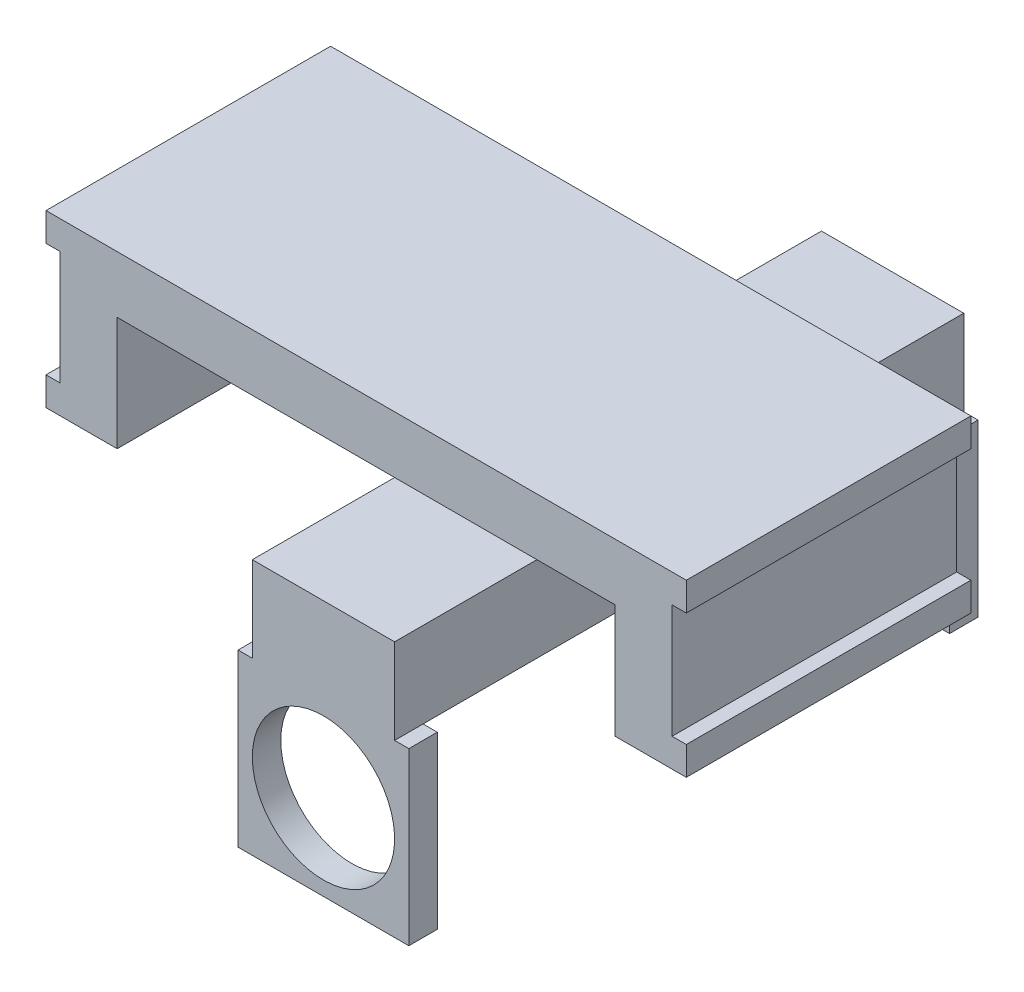
ISO-10303-21;
HEADER;
FILE_DESCRIPTION(('STEP AP214'),'2;1');
FILE_NAME('part.step','',(''),(''),'','','');
FILE_SCHEMA(('AUTOMOTIVE_DESIGN { 1 0 10303 214 1 1 1 1 }'));
ENDSEC;
DATA;
#1=APPLICATION_CONTEXT('core data for automotive mechanical design processes');
#2=APPLICATION_PROTOCOL_DEFINITION('international standard','automotive_design',2000,#1);
#3=PRODUCT_CONTEXT('',#1,'mechanical');
#4=PRODUCT('Part','Part','',(#3));
#5=PRODUCT_RELATED_PRODUCT_CATEGORY('part','',(#4));
#6=PRODUCT_DEFINITION_FORMATION('','',#4);
#7=PRODUCT_DEFINITION_CONTEXT('part definition',#1,'design');
#8=PRODUCT_DEFINITION('design','',#6,#7);
#9=PRODUCT_DEFINITION_SHAPE('','',#8);
#10=(LENGTH_UNIT() NAMED_UNIT(*) SI_UNIT(.MILLI.,.METRE.));
#11=(NAMED_UNIT(*) PLANE_ANGLE_UNIT() SI_UNIT($,.RADIAN.));
#12=(NAMED_UNIT(*) SI_UNIT($,.STERADIAN.) SOLID_ANGLE_UNIT());
#13=UNCERTAINTY_MEASURE_WITH_UNIT(LENGTH_MEASURE(1.E-05),#10,'distance_accuracy_value','');
#14=(GEOMETRIC_REPRESENTATION_CONTEXT(3) GLOBAL_UNCERTAINTY_ASSIGNED_CONTEXT((#13)) GLOBAL_UNIT_ASSIGNED_CONTEXT((#10,
#11,#12)) REPRESENTATION_CONTEXT('',''));
#15=CARTESIAN_POINT('',(0.,0.,0.));
#16=DIRECTION('',(0.,0.,1.));
#17=DIRECTION('',(1.,0.,0.));
#18=AXIS2_PLACEMENT_3D('',#15,#16,#17);
#19=CARTESIAN_POINT('',(0.,2.54,0.));
#20=DIRECTION('',(0.,-1.,0.));
#21=DIRECTION('',(0.,0.,-1.));
#22=AXIS2_PLACEMENT_3D('',#19,#20,#21);
#23=PLANE('',#22);
#24=DIRECTION('',(0.,0.,1.));
#25=VECTOR('',#24,1.);
#26=CARTESIAN_POINT('',(15.24,2.54,0.));
#27=LINE('',#26,#25);
#28=CARTESIAN_POINT('',(15.24,2.54,-22.86));
#29=VERTEX_POINT('',#28);
#30=CARTESIAN_POINT('',(15.24,2.54,22.86));
#31=VERTEX_POINT('',#30);
#32=EDGE_CURVE('E340',#29,#31,#27,.T.);
#33=ORIENTED_EDGE('',*,*,#32,.T.);
#34=DIRECTION('',(1.,0.,0.));
#35=VECTOR('',#34,1.);
#36=CARTESIAN_POINT('',(1.27,2.54,22.86));
#37=LINE('',#36,#35);
#38=CARTESIAN_POINT('',(2.54,2.54,22.86));
#39=VERTEX_POINT('',#38);
#40=EDGE_CURVE('E57',#39,#31,#37,.T.);
#41=ORIENTED_EDGE('',*,*,#40,.F.);
#42=DIRECTION('',(0.,0.,-1.));
#43=VECTOR('',#42,1.);
#44=CARTESIAN_POINT('',(2.54,2.54,0.));
#45=LINE('',#44,#43);
#46=CARTESIAN_POINT('',(2.54,2.54,-22.86));
#47=VERTEX_POINT('',#46);
#48=EDGE_CURVE('E341',#39,#47,#45,.T.);
#49=ORIENTED_EDGE('',*,*,#48,.T.);
#50=DIRECTION('',(1.,0.,0.));
#51=VECTOR('',#50,1.);
#52=CARTESIAN_POINT('',(1.27,2.54,-22.86));
#53=LINE('',#52,#51);
#54=EDGE_CURVE('E11',#47,#29,#53,.T.);
#55=ORIENTED_EDGE('',*,*,#54,.T.);
#56=EDGE_LOOP('',(#33,#41,#49,#55));
#57=FACE_BOUND('',#56,.T.);
#58=ADVANCED_FACE('F39',(#57),#23,.T.);
#59=CARTESIAN_POINT('',(0.,10.16,0.));
#60=DIRECTION('',(0.,-1.,0.));
#61=DIRECTION('',(0.,0.,-1.));
#62=AXIS2_PLACEMENT_3D('',#59,#60,#61);
#63=PLANE('',#62);
#64=DIRECTION('',(1.,0.,0.));
#65=VECTOR('',#64,1.);
#66=CARTESIAN_POINT('',(-22.225,10.16,-12.7));
#67=LINE('',#66,#65);
#68=CARTESIAN_POINT('',(-22.225,10.16,-12.7));
#69=VERTEX_POINT('',#68);
#70=CARTESIAN_POINT('',(2.54,10.16,-12.7));
#71=VERTEX_POINT('',#70);
#72=EDGE_CURVE('E426',#69,#71,#67,.T.);
#73=ORIENTED_EDGE('',*,*,#72,.T.);
#74=DIRECTION('',(0.,0.,1.));
#75=VECTOR('',#74,1.);
#76=CARTESIAN_POINT('',(2.54,10.16,0.));
#77=LINE('',#76,#75);
#78=CARTESIAN_POINT('',(2.54,10.16,12.7));
#79=VERTEX_POINT('',#78);
#80=EDGE_CURVE('E43',#71,#79,#77,.T.);
#81=ORIENTED_EDGE('',*,*,#80,.T.);
#82=DIRECTION('',(-1.,0.,0.));
#83=VECTOR('',#82,1.);
#84=CARTESIAN_POINT('',(-22.225,10.16,12.7));
#85=LINE('',#84,#83);
#86=CARTESIAN_POINT('',(-22.225,10.16,12.7));
#87=VERTEX_POINT('',#86);
#88=EDGE_CURVE('E433',#79,#87,#85,.T.);
#89=ORIENTED_EDGE('',*,*,#88,.T.);
#90=DIRECTION('',(0.,0.,-1.));
#91=VECTOR('',#90,1.);
#92=CARTESIAN_POINT('',(-22.225,10.16,12.7));
#93=LINE('',#92,#91);
#94=EDGE_CURVE('E421',#87,#69,#93,.T.);
#95=ORIENTED_EDGE('',*,*,#94,.T.);
#96=EDGE_LOOP('',(#73,#81,#89,#95));
#97=FACE_BOUND('',#96,.T.);
#98=ADVANCED_FACE('F497',(#97),#63,.T.);
#99=CARTESIAN_POINT('',(22.225,10.16,12.7));
#100=VERTEX_POINT('',#99);
#101=CARTESIAN_POINT('',(15.24,10.16,12.7));
#102=VERTEX_POINT('',#101);
#103=EDGE_CURVE('E434',#100,#102,#85,.T.);
#104=ORIENTED_EDGE('',*,*,#103,.T.);
#105=DIRECTION('',(0.,0.,-1.));
#106=VECTOR('',#105,1.);
#107=CARTESIAN_POINT('',(15.24,10.16,0.));
#108=LINE('',#107,#106);
#109=CARTESIAN_POINT('',(15.24,10.16,-12.7));
#110=VERTEX_POINT('',#109);
#111=EDGE_CURVE('E488',#102,#110,#108,.T.);
#112=ORIENTED_EDGE('',*,*,#111,.T.);
#113=CARTESIAN_POINT('',(22.225,10.16,-12.7));
#114=VERTEX_POINT('',#113);
#115=EDGE_CURVE('E424',#110,#114,#67,.T.);
#116=ORIENTED_EDGE('',*,*,#115,.T.);
#117=DIRECTION('',(0.,0.,1.));
#118=VECTOR('',#117,1.);
#119=CARTESIAN_POINT('',(22.225,10.16,12.7));
#120=LINE('',#119,#118);
#121=EDGE_CURVE('E429',#114,#100,#120,.T.);
#122=ORIENTED_EDGE('',*,*,#121,.T.);
#123=EDGE_LOOP('',(#104,#112,#116,#122));
#124=FACE_BOUND('',#123,.T.);
#125=ADVANCED_FACE('F547',(#124),#63,.T.);
#126=CARTESIAN_POINT('',(28.575,15.24,12.7));
#127=DIRECTION('',(-1.,0.,0.));
#128=DIRECTION('',(0.,0.,1.));
#129=AXIS2_PLACEMENT_3D('',#126,#127,#128);
#130=PLANE('',#129);
#131=DIRECTION('',(0.,-1.,0.));
#132=VECTOR('',#131,1.);
#133=CARTESIAN_POINT('',(28.575,15.24,-12.7));
#134=LINE('',#133,#132);
#135=CARTESIAN_POINT('',(28.575,2.54000000000001,-12.7));
#136=VERTEX_POINT('',#135);
#137=CARTESIAN_POINT('',(28.575,0.,-12.7));
#138=VERTEX_POINT('',#137);
#139=EDGE_CURVE('E485',#136,#138,#134,.T.);
#140=ORIENTED_EDGE('',*,*,#139,.F.);
#141=DIRECTION('',(0.,0.,1.));
#142=VECTOR('',#141,1.);
#143=CARTESIAN_POINT('',(28.575,2.54000000000001,-12.7));
#144=LINE('',#143,#142);
#145=CARTESIAN_POINT('',(28.575,2.54000000000001,12.7));
#146=VERTEX_POINT('',#145);
#147=EDGE_CURVE('E368',#136,#146,#144,.T.);
#148=ORIENTED_EDGE('',*,*,#147,.T.);
#149=DIRECTION('',(0.,-1.,0.));
#150=VECTOR('',#149,1.);
#151=CARTESIAN_POINT('',(28.575,15.24,12.7));
#152=LINE('',#151,#150);
#153=CARTESIAN_POINT('',(28.575,0.,12.7));
#154=VERTEX_POINT('',#153);
#155=EDGE_CURVE('E461',#146,#154,#152,.T.);
#156=ORIENTED_EDGE('',*,*,#155,.T.);
#157=DIRECTION('',(0.,0.,-1.));
#158=VECTOR('',#157,1.);
#159=CARTESIAN_POINT('',(28.575,0.,12.7));
#160=LINE('',#159,#158);
#161=EDGE_CURVE('E443',#154,#138,#160,.T.);
#162=ORIENTED_EDGE('',*,*,#161,.T.);
#163=EDGE_LOOP('',(#140,#148,#156,#162));
#164=FACE_BOUND('',#163,.T.);
#165=ADVANCED_FACE('F623',(#164),#130,.F.);
#166=CARTESIAN_POINT('',(-28.575,15.24,12.7));
#167=DIRECTION('',(1.,0.,0.));
#168=DIRECTION('',(0.,0.,-1.));
#169=AXIS2_PLACEMENT_3D('',#166,#167,#168);
#170=PLANE('',#169);
#171=DIRECTION('',(0.,-1.,0.));
#172=VECTOR('',#171,1.);
#173=CARTESIAN_POINT('',(-28.575,15.24,-12.7));
#174=LINE('',#173,#172);
#175=CARTESIAN_POINT('',(-28.575,15.24,-12.7));
#176=VERTEX_POINT('',#175);
#177=CARTESIAN_POINT('',(-28.575,12.7,-12.7));
#178=VERTEX_POINT('',#177);
#179=EDGE_CURVE('E482',#176,#178,#174,.T.);
#180=ORIENTED_EDGE('',*,*,#179,.T.);
#181=DIRECTION('',(0.,0.,1.));
#182=VECTOR('',#181,1.);
#183=CARTESIAN_POINT('',(-28.575,12.7,-12.7));
#184=LINE('',#183,#182);
#185=CARTESIAN_POINT('',(-28.575,12.7,12.7));
#186=VERTEX_POINT('',#185);
#187=EDGE_CURVE('E388',#178,#186,#184,.T.);
#188=ORIENTED_EDGE('',*,*,#187,.T.);
#189=DIRECTION('',(0.,-1.,0.));
#190=VECTOR('',#189,1.);
#191=CARTESIAN_POINT('',(-28.575,15.24,12.7));
#192=LINE('',#191,#190);
#193=CARTESIAN_POINT('',(-28.575,15.24,12.7));
#194=VERTEX_POINT('',#193);
#195=EDGE_CURVE('E478',#194,#186,#192,.T.);
#196=ORIENTED_EDGE('',*,*,#195,.F.);
#197=DIRECTION('',(0.,0.,1.));
#198=VECTOR('',#197,1.);
#199=CARTESIAN_POINT('',(-28.575,15.24,12.7));
#200=LINE('',#199,#198);
#201=EDGE_CURVE('E457',#176,#194,#200,.T.);
#202=ORIENTED_EDGE('',*,*,#201,.F.);
#203=EDGE_LOOP('',(#180,#188,#196,#202));
#204=FACE_BOUND('',#203,.T.);
#205=ADVANCED_FACE('F615',(#204),#170,.F.);
#206=CARTESIAN_POINT('',(0.,0.,0.));
#207=DIRECTION('',(0.,-1.,0.));
#208=DIRECTION('',(0.,0.,-1.));
#209=AXIS2_PLACEMENT_3D('',#206,#207,#208);
#210=PLANE('',#209);
#211=DIRECTION('',(0.,0.,-1.));
#212=VECTOR('',#211,1.);
#213=CARTESIAN_POINT('',(-22.225,0.,12.7));
#214=LINE('',#213,#212);
#215=CARTESIAN_POINT('',(-22.225,0.,12.7));
#216=VERTEX_POINT('',#215);
#217=CARTESIAN_POINT('',(-22.225,0.,-12.7));
#218=VERTEX_POINT('',#217);
#219=EDGE_CURVE('E391',#216,#218,#214,.T.);
#220=ORIENTED_EDGE('',*,*,#219,.F.);
#221=DIRECTION('',(1.,0.,0.));
#222=VECTOR('',#221,1.);
#223=CARTESIAN_POINT('',(-28.575,0.,12.7));
#224=LINE('',#223,#222);
#225=CARTESIAN_POINT('',(-28.575,0.,12.7));
#226=VERTEX_POINT('',#225);
#227=EDGE_CURVE('E455',#226,#216,#224,.T.);
#228=ORIENTED_EDGE('',*,*,#227,.F.);
#229=DIRECTION('',(0.,0.,1.));
#230=VECTOR('',#229,1.);
#231=CARTESIAN_POINT('',(-28.575,0.,12.7));
#232=LINE('',#231,#230);
#233=CARTESIAN_POINT('',(-28.575,0.,-12.7));
#234=VERTEX_POINT('',#233);
#235=EDGE_CURVE('E468',#234,#226,#232,.T.);
#236=ORIENTED_EDGE('',*,*,#235,.F.);
#237=DIRECTION('',(-1.,0.,0.));
#238=VECTOR('',#237,1.);
#239=CARTESIAN_POINT('',(-28.575,0.,-12.7));
#240=LINE('',#239,#238);
#241=EDGE_CURVE('E464',#218,#234,#240,.T.);
#242=ORIENTED_EDGE('',*,*,#241,.F.);
#243=EDGE_LOOP('',(#220,#228,#236,#242));
#244=FACE_BOUND('',#243,.T.);
#245=ADVANCED_FACE('F608',(#244),#210,.T.);
#246=CARTESIAN_POINT('',(28.575,15.24,12.7));
#247=VERTEX_POINT('',#246);
#248=CARTESIAN_POINT('',(28.575,12.7,12.7));
#249=VERTEX_POINT('',#248);
#250=EDGE_CURVE('E474',#247,#249,#152,.T.);
#251=ORIENTED_EDGE('',*,*,#250,.T.);
#252=DIRECTION('',(0.,0.,1.));
#253=VECTOR('',#252,1.);
#254=CARTESIAN_POINT('',(28.575,12.7,-12.7));
#255=LINE('',#254,#253);
#256=CARTESIAN_POINT('',(28.575,12.7,-12.7));
#257=VERTEX_POINT('',#256);
#258=EDGE_CURVE('E397',#257,#249,#255,.T.);
#259=ORIENTED_EDGE('',*,*,#258,.F.);
#260=CARTESIAN_POINT('',(28.575,15.24,-12.7));
#261=VERTEX_POINT('',#260);
#262=EDGE_CURVE('E486',#261,#257,#134,.T.);
#263=ORIENTED_EDGE('',*,*,#262,.F.);
#264=DIRECTION('',(0.,0.,-1.));
#265=VECTOR('',#264,1.);
#266=CARTESIAN_POINT('',(28.575,15.24,12.7));
#267=LINE('',#266,#265);
#268=EDGE_CURVE('E451',#247,#261,#267,.T.);
#269=ORIENTED_EDGE('',*,*,#268,.F.);
#270=EDGE_LOOP('',(#251,#259,#263,#269));
#271=FACE_BOUND('',#270,.T.);
#272=ADVANCED_FACE('F41',(#271),#130,.F.);
#273=CARTESIAN_POINT('',(-28.575,15.24,-12.7));
#274=DIRECTION('',(0.,0.,1.));
#275=DIRECTION('',(1.,0.,0.));
#276=AXIS2_PLACEMENT_3D('',#273,#274,#275);
#277=PLANE('',#276);
#278=DIRECTION('',(0.,1.,0.));
#279=VECTOR('',#278,1.);
#280=CARTESIAN_POINT('',(-27.305,12.7,-12.7));
#281=LINE('',#280,#279);
#282=CARTESIAN_POINT('',(-27.305,2.54,-12.7));
#283=VERTEX_POINT('',#282);
#284=CARTESIAN_POINT('',(-27.305,12.7,-12.7));
#285=VERTEX_POINT('',#284);
#286=EDGE_CURVE('E372',#283,#285,#281,.T.);
#287=ORIENTED_EDGE('',*,*,#286,.T.);
#288=DIRECTION('',(-1.,0.,0.));
#289=VECTOR('',#288,1.);
#290=CARTESIAN_POINT('',(-28.575,12.7,-12.7));
#291=LINE('',#290,#289);
#292=EDGE_CURVE('E376',#285,#178,#291,.T.);
#293=ORIENTED_EDGE('',*,*,#292,.T.);
#294=ORIENTED_EDGE('',*,*,#179,.F.);
#295=DIRECTION('',(-1.,0.,0.));
#296=VECTOR('',#295,1.);
#297=CARTESIAN_POINT('',(-28.575,15.24,-12.7));
#298=LINE('',#297,#296);
#299=EDGE_CURVE('E454',#261,#176,#298,.T.);
#300=ORIENTED_EDGE('',*,*,#299,.F.);
#301=ORIENTED_EDGE('',*,*,#262,.T.);
#302=DIRECTION('',(-1.,0.,0.));
#303=VECTOR('',#302,1.);
#304=CARTESIAN_POINT('',(28.575,12.7,-12.7));
#305=LINE('',#304,#303);
#306=CARTESIAN_POINT('',(27.305,12.7,-12.7));
#307=VERTEX_POINT('',#306);
#308=EDGE_CURVE('E409',#257,#307,#305,.T.);
#309=ORIENTED_EDGE('',*,*,#308,.T.);
#310=DIRECTION('',(0.,-1.,0.));
#311=VECTOR('',#310,1.);
#312=CARTESIAN_POINT('',(27.305,12.7,-12.7));
#313=LINE('',#312,#311);
#314=CARTESIAN_POINT('',(27.305,2.54000000000001,-12.7));
#315=VERTEX_POINT('',#314);
#316=EDGE_CURVE('E416',#307,#315,#313,.T.);
#317=ORIENTED_EDGE('',*,*,#316,.T.);
#318=DIRECTION('',(1.,0.,0.));
#319=VECTOR('',#318,1.);
#320=CARTESIAN_POINT('',(28.575,2.54000000000001,-12.7));
#321=LINE('',#320,#319);
#322=EDGE_CURVE('E399',#315,#136,#321,.T.);
#323=ORIENTED_EDGE('',*,*,#322,.T.);
#324=ORIENTED_EDGE('',*,*,#139,.T.);
#325=CARTESIAN_POINT('',(22.225,0.,-12.7));
#326=VERTEX_POINT('',#325);
#327=EDGE_CURVE('E465',#138,#326,#240,.T.);
#328=ORIENTED_EDGE('',*,*,#327,.T.);
#329=DIRECTION('',(0.,-1.,0.));
#330=VECTOR('',#329,1.);
#331=CARTESIAN_POINT('',(22.225,10.16,-12.7));
#332=LINE('',#331,#330);
#333=EDGE_CURVE('E447',#114,#326,#332,.T.);
#334=ORIENTED_EDGE('',*,*,#333,.F.);
#335=ORIENTED_EDGE('',*,*,#115,.F.);
#336=EDGE_CURVE('E430',#71,#110,#67,.T.);
#337=ORIENTED_EDGE('',*,*,#336,.F.);
#338=ORIENTED_EDGE('',*,*,#72,.F.);
#339=DIRECTION('',(0.,-1.,0.));
#340=VECTOR('',#339,1.);
#341=CARTESIAN_POINT('',(-22.225,10.16,-12.7));
#342=LINE('',#341,#340);
#343=EDGE_CURVE('E437',#69,#218,#342,.T.);
#344=ORIENTED_EDGE('',*,*,#343,.T.);
#345=ORIENTED_EDGE('',*,*,#241,.T.);
#346=CARTESIAN_POINT('',(-28.575,2.54,-12.7));
#347=VERTEX_POINT('',#346);
#348=EDGE_CURVE('E481',#347,#234,#174,.T.);
#349=ORIENTED_EDGE('',*,*,#348,.F.);
#350=DIRECTION('',(1.,0.,0.));
#351=VECTOR('',#350,1.);
#352=CARTESIAN_POINT('',(-28.575,2.54,-12.7));
#353=LINE('',#352,#351);
#354=EDGE_CURVE('E369',#347,#283,#353,.T.);
#355=ORIENTED_EDGE('',*,*,#354,.T.);
#356=EDGE_LOOP('',(#287,#293,#294,#300,#301,#309,#317,#323,#324,#328,#334,#335,#337,#338,#344,
#345,#349,#355));
#357=FACE_BOUND('',#356,.T.);
#358=ADVANCED_FACE('F613',(#357),#277,.F.);
#359=CARTESIAN_POINT('',(-28.575,2.54000000000001,12.7));
#360=VERTEX_POINT('',#359);
#361=EDGE_CURVE('E477',#360,#226,#192,.T.);
#362=ORIENTED_EDGE('',*,*,#361,.F.);
#363=DIRECTION('',(0.,0.,1.));
#364=VECTOR('',#363,1.);
#365=CARTESIAN_POINT('',(-28.575,2.54,-12.7));
#366=LINE('',#365,#364);
#367=EDGE_CURVE('E379',#347,#360,#366,.T.);
#368=ORIENTED_EDGE('',*,*,#367,.F.);
#369=ORIENTED_EDGE('',*,*,#348,.T.);
#370=ORIENTED_EDGE('',*,*,#235,.T.);
#371=EDGE_LOOP('',(#362,#368,#369,#370));
#372=FACE_BOUND('',#371,.T.);
#373=ADVANCED_FACE('F611',(#372),#170,.F.);
#374=CARTESIAN_POINT('',(-28.575,15.24,12.7));
#375=DIRECTION('',(0.,0.,-1.));
#376=DIRECTION('',(-1.,0.,0.));
#377=AXIS2_PLACEMENT_3D('',#374,#375,#376);
#378=PLANE('',#377);
#379=ORIENTED_EDGE('',*,*,#195,.T.);
#380=DIRECTION('',(-1.,0.,0.));
#381=VECTOR('',#380,1.);
#382=CARTESIAN_POINT('',(-28.575,12.7,12.7));
#383=LINE('',#382,#381);
#384=CARTESIAN_POINT('',(-27.305,12.7,12.7));
#385=VERTEX_POINT('',#384);
#386=EDGE_CURVE('E373',#385,#186,#383,.T.);
#387=ORIENTED_EDGE('',*,*,#386,.F.);
#388=DIRECTION('',(0.,1.,0.));
#389=VECTOR('',#388,1.);
#390=CARTESIAN_POINT('',(-27.305,12.7,12.7));
#391=LINE('',#390,#389);
#392=CARTESIAN_POINT('',(-27.305,2.54,12.7));
#393=VERTEX_POINT('',#392);
#394=EDGE_CURVE('E383',#393,#385,#391,.T.);
#395=ORIENTED_EDGE('',*,*,#394,.F.);
#396=DIRECTION('',(1.,0.,0.));
#397=VECTOR('',#396,1.);
#398=CARTESIAN_POINT('',(-28.575,2.54,12.7));
#399=LINE('',#398,#397);
#400=EDGE_CURVE('E380',#360,#393,#399,.T.);
#401=ORIENTED_EDGE('',*,*,#400,.F.);
#402=ORIENTED_EDGE('',*,*,#361,.T.);
#403=ORIENTED_EDGE('',*,*,#227,.T.);
#404=DIRECTION('',(0.,-1.,0.));
#405=VECTOR('',#404,1.);
#406=CARTESIAN_POINT('',(-22.225,10.16,12.7));
#407=LINE('',#406,#405);
#408=EDGE_CURVE('E441',#87,#216,#407,.T.);
#409=ORIENTED_EDGE('',*,*,#408,.F.);
#410=ORIENTED_EDGE('',*,*,#88,.F.);
#411=EDGE_CURVE('E438',#102,#79,#85,.T.);
#412=ORIENTED_EDGE('',*,*,#411,.F.);
#413=ORIENTED_EDGE('',*,*,#103,.F.);
#414=DIRECTION('',(0.,-1.,0.));
#415=VECTOR('',#414,1.);
#416=CARTESIAN_POINT('',(22.225,10.16,12.7));
#417=LINE('',#416,#415);
#418=CARTESIAN_POINT('',(22.225,0.,12.7));
#419=VERTEX_POINT('',#418);
#420=EDGE_CURVE('E444',#100,#419,#417,.T.);
#421=ORIENTED_EDGE('',*,*,#420,.T.);
#422=EDGE_CURVE('E471',#419,#154,#224,.T.);
#423=ORIENTED_EDGE('',*,*,#422,.T.);
#424=ORIENTED_EDGE('',*,*,#155,.F.);
#425=DIRECTION('',(1.,0.,0.));
#426=VECTOR('',#425,1.);
#427=CARTESIAN_POINT('',(28.575,2.54000000000001,12.7));
#428=LINE('',#427,#426);
#429=CARTESIAN_POINT('',(27.305,2.54000000000001,12.7));
#430=VERTEX_POINT('',#429);
#431=EDGE_CURVE('E406',#430,#146,#428,.T.);
#432=ORIENTED_EDGE('',*,*,#431,.F.);
#433=DIRECTION('',(0.,-1.,0.));
#434=VECTOR('',#433,1.);
#435=CARTESIAN_POINT('',(27.305,12.7,12.7));
#436=LINE('',#435,#434);
#437=CARTESIAN_POINT('',(27.305,12.7,12.7));
#438=VERTEX_POINT('',#437);
#439=EDGE_CURVE('E408',#438,#430,#436,.T.);
#440=ORIENTED_EDGE('',*,*,#439,.F.);
#441=DIRECTION('',(-1.,0.,0.));
#442=VECTOR('',#441,1.);
#443=CARTESIAN_POINT('',(28.575,12.7,12.7));
#444=LINE('',#443,#442);
#445=EDGE_CURVE('E384',#249,#438,#444,.T.);
#446=ORIENTED_EDGE('',*,*,#445,.F.);
#447=ORIENTED_EDGE('',*,*,#250,.F.);
#448=DIRECTION('',(1.,0.,0.));
#449=VECTOR('',#448,1.);
#450=CARTESIAN_POINT('',(-28.575,15.24,12.7));
#451=LINE('',#450,#449);
#452=EDGE_CURVE('E459',#194,#247,#451,.T.);
#453=ORIENTED_EDGE('',*,*,#452,.F.);
#454=EDGE_LOOP('',(#379,#387,#395,#401,#402,#403,#409,#410,#412,#413,#421,#423,#424,#432,#440,
#446,#447,#453));
#455=FACE_BOUND('',#454,.T.);
#456=ADVANCED_FACE('F505',(#455),#378,.F.);
#457=CARTESIAN_POINT('',(0.,15.24,0.));
#458=DIRECTION('',(0.,-1.,0.));
#459=DIRECTION('',(0.,0.,-1.));
#460=AXIS2_PLACEMENT_3D('',#457,#458,#459);
#461=PLANE('',#460);
#462=ORIENTED_EDGE('',*,*,#268,.T.);
#463=ORIENTED_EDGE('',*,*,#299,.T.);
#464=ORIENTED_EDGE('',*,*,#201,.T.);
#465=ORIENTED_EDGE('',*,*,#452,.T.);
#466=EDGE_LOOP('',(#462,#463,#464,#465));
#467=FACE_BOUND('',#466,.T.);
#468=ADVANCED_FACE('F601',(#467),#461,.F.);
#469=DIRECTION('',(0.,0.,1.));
#470=VECTOR('',#469,1.);
#471=CARTESIAN_POINT('',(22.225,0.,12.7));
#472=LINE('',#471,#470);
#473=EDGE_CURVE('E425',#326,#419,#472,.T.);
#474=ORIENTED_EDGE('',*,*,#473,.F.);
#475=ORIENTED_EDGE('',*,*,#327,.F.);
#476=ORIENTED_EDGE('',*,*,#161,.F.);
#477=ORIENTED_EDGE('',*,*,#422,.F.);
#478=EDGE_LOOP('',(#474,#475,#476,#477));
#479=FACE_BOUND('',#478,.T.);
#480=ADVANCED_FACE('F599',(#479),#210,.T.);
#481=CARTESIAN_POINT('',(-22.225,10.16,12.7));
#482=DIRECTION('',(-1.,0.,0.));
#483=DIRECTION('',(0.,0.,1.));
#484=AXIS2_PLACEMENT_3D('',#481,#482,#483);
#485=PLANE('',#484);
#486=ORIENTED_EDGE('',*,*,#219,.T.);
#487=ORIENTED_EDGE('',*,*,#343,.F.);
#488=ORIENTED_EDGE('',*,*,#94,.F.);
#489=ORIENTED_EDGE('',*,*,#408,.T.);
#490=EDGE_LOOP('',(#486,#487,#488,#489));
#491=FACE_BOUND('',#490,.T.);
#492=ADVANCED_FACE('F595',(#491),#485,.F.);
#493=CARTESIAN_POINT('',(22.225,10.16,12.7));
#494=DIRECTION('',(1.,0.,0.));
#495=DIRECTION('',(0.,0.,-1.));
#496=AXIS2_PLACEMENT_3D('',#493,#494,#495);
#497=PLANE('',#496);
#498=ORIENTED_EDGE('',*,*,#473,.T.);
#499=ORIENTED_EDGE('',*,*,#420,.F.);
#500=ORIENTED_EDGE('',*,*,#121,.F.);
#501=ORIENTED_EDGE('',*,*,#333,.T.);
#502=EDGE_LOOP('',(#498,#499,#500,#501));
#503=FACE_BOUND('',#502,.T.);
#504=ADVANCED_FACE('F590',(#503),#497,.F.);
#505=CARTESIAN_POINT('',(28.575,2.54000000000001,-12.7));
#506=DIRECTION('',(0.,-1.,0.));
#507=DIRECTION('',(0.,0.,-1.));
#508=AXIS2_PLACEMENT_3D('',#505,#506,#507);
#509=PLANE('',#508);
#510=ORIENTED_EDGE('',*,*,#431,.T.);
#511=ORIENTED_EDGE('',*,*,#147,.F.);
#512=ORIENTED_EDGE('',*,*,#322,.F.);
#513=DIRECTION('',(0.,0.,1.));
#514=VECTOR('',#513,1.);
#515=CARTESIAN_POINT('',(27.305,2.54000000000001,-12.7));
#516=LINE('',#515,#514);
#517=EDGE_CURVE('E402',#315,#430,#516,.T.);
#518=ORIENTED_EDGE('',*,*,#517,.T.);
#519=EDGE_LOOP('',(#510,#511,#512,#518));
#520=FACE_BOUND('',#519,.T.);
#521=ADVANCED_FACE('F587',(#520),#509,.F.);
#522=CARTESIAN_POINT('',(27.305,12.7,-12.7));
#523=DIRECTION('',(-1.,0.,0.));
#524=DIRECTION('',(0.,-1.,0.));
#525=AXIS2_PLACEMENT_3D('',#522,#523,#524);
#526=PLANE('',#525);
#527=ORIENTED_EDGE('',*,*,#439,.T.);
#528=ORIENTED_EDGE('',*,*,#517,.F.);
#529=ORIENTED_EDGE('',*,*,#316,.F.);
#530=DIRECTION('',(0.,0.,1.));
#531=VECTOR('',#530,1.);
#532=CARTESIAN_POINT('',(27.305,12.7,-12.7));
#533=LINE('',#532,#531);
#534=EDGE_CURVE('E400',#307,#438,#533,.T.);
#535=ORIENTED_EDGE('',*,*,#534,.T.);
#536=EDGE_LOOP('',(#527,#528,#529,#535));
#537=FACE_BOUND('',#536,.T.);
#538=ADVANCED_FACE('F583',(#537),#526,.F.);
#539=CARTESIAN_POINT('',(28.575,12.7,-12.7));
#540=DIRECTION('',(0.,1.,0.));
#541=DIRECTION('',(0.,0.,1.));
#542=AXIS2_PLACEMENT_3D('',#539,#540,#541);
#543=PLANE('',#542);
#544=ORIENTED_EDGE('',*,*,#445,.T.);
#545=ORIENTED_EDGE('',*,*,#534,.F.);
#546=ORIENTED_EDGE('',*,*,#308,.F.);
#547=ORIENTED_EDGE('',*,*,#258,.T.);
#548=EDGE_LOOP('',(#544,#545,#546,#547));
#549=FACE_BOUND('',#548,.T.);
#550=ADVANCED_FACE('F573',(#549),#543,.F.);
#551=CARTESIAN_POINT('',(-28.575,12.7,-12.7));
#552=DIRECTION('',(0.,1.,0.));
#553=DIRECTION('',(-1.,0.,0.));
#554=AXIS2_PLACEMENT_3D('',#551,#552,#553);
#555=PLANE('',#554);
#556=ORIENTED_EDGE('',*,*,#386,.T.);
#557=ORIENTED_EDGE('',*,*,#187,.F.);
#558=ORIENTED_EDGE('',*,*,#292,.F.);
#559=DIRECTION('',(0.,0.,1.));
#560=VECTOR('',#559,1.);
#561=CARTESIAN_POINT('',(-27.305,12.7,-12.7));
#562=LINE('',#561,#560);
#563=EDGE_CURVE('E392',#285,#385,#562,.T.);
#564=ORIENTED_EDGE('',*,*,#563,.T.);
#565=EDGE_LOOP('',(#556,#557,#558,#564));
#566=FACE_BOUND('',#565,.T.);
#567=ADVANCED_FACE('F569',(#566),#555,.F.);
#568=CARTESIAN_POINT('',(-27.305,12.7,-12.7));
#569=DIRECTION('',(1.,0.,0.));
#570=DIRECTION('',(0.,0.,-1.));
#571=AXIS2_PLACEMENT_3D('',#568,#569,#570);
#572=PLANE('',#571);
#573=ORIENTED_EDGE('',*,*,#394,.T.);
#574=ORIENTED_EDGE('',*,*,#563,.F.);
#575=ORIENTED_EDGE('',*,*,#286,.F.);
#576=DIRECTION('',(0.,0.,1.));
#577=VECTOR('',#576,1.);
#578=CARTESIAN_POINT('',(-27.305,2.54,-12.7));
#579=LINE('',#578,#577);
#580=EDGE_CURVE('E394',#283,#393,#579,.T.);
#581=ORIENTED_EDGE('',*,*,#580,.T.);
#582=EDGE_LOOP('',(#573,#574,#575,#581));
#583=FACE_BOUND('',#582,.T.);
#584=ADVANCED_FACE('F572',(#583),#572,.F.);
#585=CARTESIAN_POINT('',(-28.575,2.54,-12.7));
#586=DIRECTION('',(0.,-1.,0.));
#587=DIRECTION('',(1.,0.,0.));
#588=AXIS2_PLACEMENT_3D('',#585,#586,#587);
#589=PLANE('',#588);
#590=ORIENTED_EDGE('',*,*,#400,.T.);
#591=ORIENTED_EDGE('',*,*,#580,.F.);
#592=ORIENTED_EDGE('',*,*,#354,.F.);
#593=ORIENTED_EDGE('',*,*,#367,.T.);
#594=EDGE_LOOP('',(#590,#591,#592,#593));
#595=FACE_BOUND('',#594,.T.);
#596=ADVANCED_FACE('F556',(#595),#589,.F.);
#597=CARTESIAN_POINT('',(0.,10.16,0.));
#598=DIRECTION('',(0.,-1.,0.));
#599=DIRECTION('',(0.,0.,-1.));
#600=AXIS2_PLACEMENT_3D('',#597,#598,#599);
#601=PLANE('',#600);
#602=DIRECTION('',(0.,0.,-1.));
#603=VECTOR('',#602,1.);
#604=CARTESIAN_POINT('',(2.54,10.16,0.));
#605=LINE('',#604,#603);
#606=CARTESIAN_POINT('',(2.54,10.16,-25.4));
#607=VERTEX_POINT('',#606);
#608=EDGE_CURVE('E332',#71,#607,#605,.T.);
#609=ORIENTED_EDGE('',*,*,#608,.F.);
#610=ORIENTED_EDGE('',*,*,#336,.T.);
#611=DIRECTION('',(0.,0.,1.));
#612=VECTOR('',#611,1.);
#613=CARTESIAN_POINT('',(15.24,10.16,0.));
#614=LINE('',#613,#612);
#615=CARTESIAN_POINT('',(15.24,10.16,-25.4));
#616=VERTEX_POINT('',#615);
#617=EDGE_CURVE('E353',#616,#110,#614,.T.);
#618=ORIENTED_EDGE('',*,*,#617,.F.);
#619=DIRECTION('',(1.,0.,0.));
#620=VECTOR('',#619,1.);
#621=CARTESIAN_POINT('',(0.,10.16,-25.4));
#622=LINE('',#621,#620);
#623=EDGE_CURVE('E350',#607,#616,#622,.T.);
#624=ORIENTED_EDGE('',*,*,#623,.F.);
#625=EDGE_LOOP('',(#609,#610,#618,#624));
#626=FACE_BOUND('',#625,.T.);
#627=ADVANCED_FACE('F553',(#626),#601,.F.);
#628=CARTESIAN_POINT('',(15.24,10.16,25.4));
#629=VERTEX_POINT('',#628);
#630=EDGE_CURVE('E352',#102,#629,#614,.T.);
#631=ORIENTED_EDGE('',*,*,#630,.F.);
#632=ORIENTED_EDGE('',*,*,#411,.T.);
#633=CARTESIAN_POINT('',(2.54,10.16,25.4));
#634=VERTEX_POINT('',#633);
#635=EDGE_CURVE('E347',#634,#79,#605,.T.);
#636=ORIENTED_EDGE('',*,*,#635,.F.);
#637=DIRECTION('',(-1.,0.,0.));
#638=VECTOR('',#637,1.);
#639=CARTESIAN_POINT('',(0.,10.16,25.4));
#640=LINE('',#639,#638);
#641=EDGE_CURVE('E355',#629,#634,#640,.T.);
#642=ORIENTED_EDGE('',*,*,#641,.F.);
#643=EDGE_LOOP('',(#631,#632,#636,#642));
#644=FACE_BOUND('',#643,.T.);
#645=ADVANCED_FACE('F509',(#644),#601,.F.);
#646=CARTESIAN_POINT('',(2.54,2.54,0.));
#647=DIRECTION('',(1.,0.,0.));
#648=DIRECTION('',(0.,0.,-1.));
#649=AXIS2_PLACEMENT_3D('',#646,#647,#648);
#650=PLANE('',#649);
#651=ORIENTED_EDGE('',*,*,#635,.T.);
#652=ORIENTED_EDGE('',*,*,#80,.F.);
#653=ORIENTED_EDGE('',*,*,#608,.T.);
#654=DIRECTION('',(0.,1.,0.));
#655=VECTOR('',#654,1.);
#656=CARTESIAN_POINT('',(2.54,2.54,-25.4));
#657=LINE('',#656,#655);
#658=CARTESIAN_POINT('',(2.54,2.54,-25.4));
#659=VERTEX_POINT('',#658);
#660=EDGE_CURVE('E365',#659,#607,#657,.T.);
#661=ORIENTED_EDGE('',*,*,#660,.F.);
#662=EDGE_CURVE('E342',#47,#659,#45,.T.);
#663=ORIENTED_EDGE('',*,*,#662,.F.);
#664=ORIENTED_EDGE('',*,*,#48,.F.);
#665=CARTESIAN_POINT('',(2.54,2.54,25.4));
#666=VERTEX_POINT('',#665);
#667=EDGE_CURVE('E277',#666,#39,#45,.T.);
#668=ORIENTED_EDGE('',*,*,#667,.F.);
#669=DIRECTION('',(0.,1.,0.));
#670=VECTOR('',#669,1.);
#671=CARTESIAN_POINT('',(2.54,2.54,25.4));
#672=LINE('',#671,#670);
#673=EDGE_CURVE('E346',#666,#634,#672,.T.);
#674=ORIENTED_EDGE('',*,*,#673,.T.);
#675=EDGE_LOOP('',(#651,#652,#653,#661,#663,#664,#668,#674));
#676=FACE_BOUND('',#675,.T.);
#677=ADVANCED_FACE('F511',(#676),#650,.F.);
#678=CARTESIAN_POINT('',(0.,2.54,-25.4));
#679=DIRECTION('',(0.,0.,1.));
#680=DIRECTION('',(1.,0.,0.));
#681=AXIS2_PLACEMENT_3D('',#678,#679,#680);
#682=PLANE('',#681);
#683=ORIENTED_EDGE('',*,*,#623,.T.);
#684=DIRECTION('',(0.,1.,0.));
#685=VECTOR('',#684,1.);
#686=CARTESIAN_POINT('',(15.24,2.54,-25.4));
#687=LINE('',#686,#685);
#688=CARTESIAN_POINT('',(15.24,2.54,-25.4));
#689=VERTEX_POINT('',#688);
#690=EDGE_CURVE('E362',#689,#616,#687,.T.);
#691=ORIENTED_EDGE('',*,*,#690,.F.);
#692=DIRECTION('',(1.,0.,0.));
#693=VECTOR('',#692,1.);
#694=CARTESIAN_POINT('',(1.27,2.54,-25.4));
#695=LINE('',#694,#693);
#696=CARTESIAN_POINT('',(16.51,2.54,-25.4));
#697=VERTEX_POINT('',#696);
#698=EDGE_CURVE('E304',#689,#697,#695,.T.);
#699=ORIENTED_EDGE('',*,*,#698,.T.);
#700=DIRECTION('',(0.,-1.,0.));
#701=VECTOR('',#700,1.);
#702=CARTESIAN_POINT('',(16.51,2.54,-25.4));
#703=LINE('',#702,#701);
#704=CARTESIAN_POINT('',(16.51,-12.7,-25.4));
#705=VERTEX_POINT('',#704);
#706=EDGE_CURVE('E321',#697,#705,#703,.T.);
#707=ORIENTED_EDGE('',*,*,#706,.T.);
#708=DIRECTION('',(-1.,0.,0.));
#709=VECTOR('',#708,1.);
#710=CARTESIAN_POINT('',(16.51,-12.7,-25.4));
#711=LINE('',#710,#709);
#712=CARTESIAN_POINT('',(1.27000000000001,-12.7,-25.4));
#713=VERTEX_POINT('',#712);
#714=EDGE_CURVE('E324',#705,#713,#711,.T.);
#715=ORIENTED_EDGE('',*,*,#714,.T.);
#716=DIRECTION('',(0.,1.,0.));
#717=VECTOR('',#716,1.);
#718=CARTESIAN_POINT('',(1.27000000000001,-12.7,-25.4));
#719=LINE('',#718,#717);
#720=CARTESIAN_POINT('',(1.27,2.54,-25.4));
#721=VERTEX_POINT('',#720);
#722=EDGE_CURVE('E327',#713,#721,#719,.T.);
#723=ORIENTED_EDGE('',*,*,#722,.T.);
#724=EDGE_CURVE('E318',#721,#659,#695,.T.);
#725=ORIENTED_EDGE('',*,*,#724,.T.);
#726=ORIENTED_EDGE('',*,*,#660,.T.);
#727=EDGE_LOOP('',(#683,#691,#699,#707,#715,#723,#725,#726));
#728=FACE_BOUND('',#727,.T.);
#729=CARTESIAN_POINT('',(8.89,-5.08,-25.4));
#730=DIRECTION('',(0.,0.,-1.));
#731=DIRECTION('',(-1.,0.,0.));
#732=AXIS2_PLACEMENT_3D('',#729,#730,#731);
#733=CIRCLE('',#732,6.35);
#734=CARTESIAN_POINT('',(2.54,-5.08,-25.4));
#735=VERTEX_POINT('',#734);
#736=EDGE_CURVE('E300',#735,#735,#733,.T.);
#737=ORIENTED_EDGE('',*,*,#736,.F.);
#738=EDGE_LOOP('',(#737));
#739=FACE_BOUND('',#738,.T.);
#740=ADVANCED_FACE('F564',(#728,#739),#682,.F.);
#741=CARTESIAN_POINT('',(15.24,2.54,0.));
#742=DIRECTION('',(-1.,0.,0.));
#743=DIRECTION('',(0.,0.,1.));
#744=AXIS2_PLACEMENT_3D('',#741,#742,#743);
#745=PLANE('',#744);
#746=ORIENTED_EDGE('',*,*,#617,.T.);
#747=ORIENTED_EDGE('',*,*,#111,.F.);
#748=ORIENTED_EDGE('',*,*,#630,.T.);
#749=DIRECTION('',(0.,1.,0.));
#750=VECTOR('',#749,1.);
#751=CARTESIAN_POINT('',(15.24,2.54,25.4));
#752=LINE('',#751,#750);
#753=CARTESIAN_POINT('',(15.24,2.54,25.4));
#754=VERTEX_POINT('',#753);
#755=EDGE_CURVE('E359',#754,#629,#752,.T.);
#756=ORIENTED_EDGE('',*,*,#755,.F.);
#757=DIRECTION('',(0.,0.,1.));
#758=VECTOR('',#757,1.);
#759=CARTESIAN_POINT('',(15.24,2.54,0.));
#760=LINE('',#759,#758);
#761=EDGE_CURVE('E65',#31,#754,#760,.T.);
#762=ORIENTED_EDGE('',*,*,#761,.F.);
#763=ORIENTED_EDGE('',*,*,#32,.F.);
#764=EDGE_CURVE('E343',#689,#29,#27,.T.);
#765=ORIENTED_EDGE('',*,*,#764,.F.);
#766=ORIENTED_EDGE('',*,*,#690,.T.);
#767=EDGE_LOOP('',(#746,#747,#748,#756,#762,#763,#765,#766));
#768=FACE_BOUND('',#767,.T.);
#769=ADVANCED_FACE('F561',(#768),#745,.F.);
#770=CARTESIAN_POINT('',(0.,2.54,25.4));
#771=DIRECTION('',(0.,0.,-1.));
#772=DIRECTION('',(-1.,0.,0.));
#773=AXIS2_PLACEMENT_3D('',#770,#771,#772);
#774=PLANE('',#773);
#775=ORIENTED_EDGE('',*,*,#641,.T.);
#776=ORIENTED_EDGE('',*,*,#673,.F.);
#777=DIRECTION('',(1.,0.,0.));
#778=VECTOR('',#777,1.);
#779=CARTESIAN_POINT('',(1.27,2.54,25.4));
#780=LINE('',#779,#778);
#781=CARTESIAN_POINT('',(1.27,2.54,25.4));
#782=VERTEX_POINT('',#781);
#783=EDGE_CURVE('E516',#782,#666,#780,.T.);
#784=ORIENTED_EDGE('',*,*,#783,.F.);
#785=DIRECTION('',(0.,1.,0.));
#786=VECTOR('',#785,1.);
#787=CARTESIAN_POINT('',(1.27000000000001,-12.7,25.4));
#788=LINE('',#787,#786);
#789=CARTESIAN_POINT('',(1.27000000000001,-12.7,25.4));
#790=VERTEX_POINT('',#789);
#791=EDGE_CURVE('E268',#790,#782,#788,.T.);
#792=ORIENTED_EDGE('',*,*,#791,.F.);
#793=DIRECTION('',(-1.,0.,0.));
#794=VECTOR('',#793,1.);
#795=CARTESIAN_POINT('',(16.51,-12.7,25.4));
#796=LINE('',#795,#794);
#797=CARTESIAN_POINT('',(16.51,-12.7,25.4));
#798=VERTEX_POINT('',#797);
#799=EDGE_CURVE('E284',#798,#790,#796,.T.);
#800=ORIENTED_EDGE('',*,*,#799,.F.);
#801=DIRECTION('',(0.,-1.,0.));
#802=VECTOR('',#801,1.);
#803=CARTESIAN_POINT('',(16.51,2.54,25.4));
#804=LINE('',#803,#802);
#805=CARTESIAN_POINT('',(16.51,2.54,25.4));
#806=VERTEX_POINT('',#805);
#807=EDGE_CURVE('E281',#806,#798,#804,.T.);
#808=ORIENTED_EDGE('',*,*,#807,.F.);
#809=EDGE_CURVE('E517',#754,#806,#780,.T.);
#810=ORIENTED_EDGE('',*,*,#809,.F.);
#811=ORIENTED_EDGE('',*,*,#755,.T.);
#812=EDGE_LOOP('',(#775,#776,#784,#792,#800,#808,#810,#811));
#813=FACE_BOUND('',#812,.T.);
#814=CARTESIAN_POINT('',(8.89,-5.08,25.4));
#815=DIRECTION('',(0.,0.,-1.));
#816=DIRECTION('',(-1.,0.,0.));
#817=AXIS2_PLACEMENT_3D('',#814,#815,#816);
#818=CIRCLE('',#817,6.35);
#819=CARTESIAN_POINT('',(2.54,-5.08,25.4));
#820=VERTEX_POINT('',#819);
#821=EDGE_CURVE('E916',#820,#820,#818,.T.);
#822=ORIENTED_EDGE('',*,*,#821,.T.);
#823=EDGE_LOOP('',(#822));
#824=FACE_BOUND('',#823,.T.);
#825=ADVANCED_FACE('F514',(#813,#824),#774,.F.);
#826=CARTESIAN_POINT('',(1.27,2.54,-22.86));
#827=DIRECTION('',(0.,1.,0.));
#828=DIRECTION('',(-1.,0.,0.));
#829=AXIS2_PLACEMENT_3D('',#826,#827,#828);
#830=PLANE('',#829);
#831=CARTESIAN_POINT('',(1.27,2.54,-22.86));
#832=VERTEX_POINT('',#831);
#833=EDGE_CURVE('E49',#832,#47,#53,.T.);
#834=ORIENTED_EDGE('',*,*,#833,.T.);
#835=ORIENTED_EDGE('',*,*,#662,.T.);
#836=ORIENTED_EDGE('',*,*,#724,.F.);
#837=DIRECTION('',(0.,0.,-1.));
#838=VECTOR('',#837,1.);
#839=CARTESIAN_POINT('',(1.27,2.54,-22.86));
#840=LINE('',#839,#838);
#841=EDGE_CURVE('E330',#832,#721,#840,.T.);
#842=ORIENTED_EDGE('',*,*,#841,.F.);
#843=EDGE_LOOP('',(#834,#835,#836,#842));
#844=FACE_BOUND('',#843,.T.);
#845=ADVANCED_FACE('F560',(#844),#830,.T.);
#846=ORIENTED_EDGE('',*,*,#698,.F.);
#847=ORIENTED_EDGE('',*,*,#764,.T.);
#848=CARTESIAN_POINT('',(16.51,2.54,-22.86));
#849=VERTEX_POINT('',#848);
#850=EDGE_CURVE('E50',#29,#849,#53,.T.);
#851=ORIENTED_EDGE('',*,*,#850,.T.);
#852=DIRECTION('',(0.,0.,-1.));
#853=VECTOR('',#852,1.);
#854=CARTESIAN_POINT('',(16.51,2.54,-22.86));
#855=LINE('',#854,#853);
#856=EDGE_CURVE('E317',#849,#697,#855,.T.);
#857=ORIENTED_EDGE('',*,*,#856,.T.);
#858=EDGE_LOOP('',(#846,#847,#851,#857));
#859=FACE_BOUND('',#858,.T.);
#860=ADVANCED_FACE('F551',(#859),#830,.T.);
#861=CARTESIAN_POINT('',(1.27000000000001,-12.7,-22.86));
#862=DIRECTION('',(-1.,0.,0.));
#863=DIRECTION('',(0.,-1.,0.));
#864=AXIS2_PLACEMENT_3D('',#861,#862,#863);
#865=PLANE('',#864);
#866=ORIENTED_EDGE('',*,*,#722,.F.);
#867=DIRECTION('',(0.,0.,-1.));
#868=VECTOR('',#867,1.);
#869=CARTESIAN_POINT('',(1.27000000000001,-12.7,-22.86));
#870=LINE('',#869,#868);
#871=CARTESIAN_POINT('',(1.27000000000001,-12.7,-22.86));
#872=VERTEX_POINT('',#871);
#873=EDGE_CURVE('E333',#872,#713,#870,.T.);
#874=ORIENTED_EDGE('',*,*,#873,.F.);
#875=DIRECTION('',(0.,1.,0.));
#876=VECTOR('',#875,1.);
#877=CARTESIAN_POINT('',(1.27000000000001,-12.7,-22.86));
#878=LINE('',#877,#876);
#879=EDGE_CURVE('E314',#872,#832,#878,.T.);
#880=ORIENTED_EDGE('',*,*,#879,.T.);
#881=ORIENTED_EDGE('',*,*,#841,.T.);
#882=EDGE_LOOP('',(#866,#874,#880,#881));
#883=FACE_BOUND('',#882,.T.);
#884=ADVANCED_FACE('F805',(#883),#865,.T.);
#885=CARTESIAN_POINT('',(16.51,-12.7,-22.86));
#886=DIRECTION('',(0.,-1.,0.));
#887=DIRECTION('',(1.,0.,0.));
#888=AXIS2_PLACEMENT_3D('',#885,#886,#887);
#889=PLANE('',#888);
#890=ORIENTED_EDGE('',*,*,#714,.F.);
#891=DIRECTION('',(0.,0.,-1.));
#892=VECTOR('',#891,1.);
#893=CARTESIAN_POINT('',(16.51,-12.7,-22.86));
#894=LINE('',#893,#892);
#895=CARTESIAN_POINT('',(16.51,-12.7,-22.86));
#896=VERTEX_POINT('',#895);
#897=EDGE_CURVE('E335',#896,#705,#894,.T.);
#898=ORIENTED_EDGE('',*,*,#897,.F.);
#899=DIRECTION('',(-1.,0.,0.));
#900=VECTOR('',#899,1.);
#901=CARTESIAN_POINT('',(16.51,-12.7,-22.86));
#902=LINE('',#901,#900);
#903=EDGE_CURVE('E311',#896,#872,#902,.T.);
#904=ORIENTED_EDGE('',*,*,#903,.T.);
#905=ORIENTED_EDGE('',*,*,#873,.T.);
#906=EDGE_LOOP('',(#890,#898,#904,#905));
#907=FACE_BOUND('',#906,.T.);
#908=ADVANCED_FACE('F813',(#907),#889,.T.);
#909=CARTESIAN_POINT('',(16.51,2.54,-22.86));
#910=DIRECTION('',(1.,0.,0.));
#911=DIRECTION('',(0.,1.,0.));
#912=AXIS2_PLACEMENT_3D('',#909,#910,#911);
#913=PLANE('',#912);
#914=ORIENTED_EDGE('',*,*,#706,.F.);
#915=ORIENTED_EDGE('',*,*,#856,.F.);
#916=DIRECTION('',(0.,-1.,0.));
#917=VECTOR('',#916,1.);
#918=CARTESIAN_POINT('',(16.51,2.54,-22.86));
#919=LINE('',#918,#917);
#920=EDGE_CURVE('E308',#849,#896,#919,.T.);
#921=ORIENTED_EDGE('',*,*,#920,.T.);
#922=ORIENTED_EDGE('',*,*,#897,.T.);
#923=EDGE_LOOP('',(#914,#915,#921,#922));
#924=FACE_BOUND('',#923,.T.);
#925=ADVANCED_FACE('F822',(#924),#913,.T.);
#926=CARTESIAN_POINT('',(0.,0.,-22.86));
#927=DIRECTION('',(0.,0.,-1.));
#928=DIRECTION('',(-1.,0.,0.));
#929=AXIS2_PLACEMENT_3D('',#926,#927,#928);
#930=PLANE('',#929);
#931=CARTESIAN_POINT('',(8.89,-5.08,-22.86));
#932=DIRECTION('',(0.,0.,-1.));
#933=DIRECTION('',(-1.,0.,0.));
#934=AXIS2_PLACEMENT_3D('',#931,#932,#933);
#935=CIRCLE('',#934,6.35);
#936=CARTESIAN_POINT('',(2.54,-5.08,-22.86));
#937=VERTEX_POINT('',#936);
#938=EDGE_CURVE('E301',#937,#937,#935,.T.);
#939=ORIENTED_EDGE('',*,*,#938,.T.);
#940=EDGE_LOOP('',(#939));
#941=FACE_BOUND('',#940,.T.);
#942=ORIENTED_EDGE('',*,*,#833,.F.);
#943=ORIENTED_EDGE('',*,*,#879,.F.);
#944=ORIENTED_EDGE('',*,*,#903,.F.);
#945=ORIENTED_EDGE('',*,*,#920,.F.);
#946=ORIENTED_EDGE('',*,*,#850,.F.);
#947=ORIENTED_EDGE('',*,*,#54,.F.);
#948=EDGE_LOOP('',(#942,#943,#944,#945,#946,#947));
#949=FACE_BOUND('',#948,.T.);
#950=ADVANCED_FACE('F831',(#941,#949),#930,.F.);
#951=CARTESIAN_POINT('',(8.89,-5.08,-22.86));
#952=DIRECTION('',(0.,0.,-1.));
#953=DIRECTION('',(-1.,0.,0.));
#954=AXIS2_PLACEMENT_3D('',#951,#952,#953);
#955=CYLINDRICAL_SURFACE('',#954,6.35);
#956=ORIENTED_EDGE('',*,*,#938,.F.);
#957=EDGE_LOOP('',(#956));
#958=FACE_BOUND('',#957,.T.);
#959=ORIENTED_EDGE('',*,*,#736,.T.);
#960=EDGE_LOOP('',(#959));
#961=FACE_BOUND('',#960,.T.);
#962=ADVANCED_FACE('F537',(#958,#961),#955,.F.);
#963=CARTESIAN_POINT('',(1.27,2.54,22.86));
#964=DIRECTION('',(0.,-1.,0.));
#965=DIRECTION('',(1.,0.,0.));
#966=AXIS2_PLACEMENT_3D('',#963,#964,#965);
#967=PLANE('',#966);
#968=ORIENTED_EDGE('',*,*,#783,.T.);
#969=ORIENTED_EDGE('',*,*,#667,.T.);
#970=CARTESIAN_POINT('',(1.27,2.54,22.86));
#971=VERTEX_POINT('',#970);
#972=EDGE_CURVE('E257',#971,#39,#37,.T.);
#973=ORIENTED_EDGE('',*,*,#972,.F.);
#974=DIRECTION('',(0.,0.,1.));
#975=VECTOR('',#974,1.);
#976=CARTESIAN_POINT('',(1.27,2.54,22.86));
#977=LINE('',#976,#975);
#978=EDGE_CURVE('E265',#971,#782,#977,.T.);
#979=ORIENTED_EDGE('',*,*,#978,.T.);
#980=EDGE_LOOP('',(#968,#969,#973,#979));
#981=FACE_BOUND('',#980,.T.);
#982=ADVANCED_FACE('F276',(#981),#967,.F.);
#983=CARTESIAN_POINT('',(16.51,2.54,22.86));
#984=VERTEX_POINT('',#983);
#985=EDGE_CURVE('E279',#31,#984,#37,.T.);
#986=ORIENTED_EDGE('',*,*,#985,.F.);
#987=ORIENTED_EDGE('',*,*,#761,.T.);
#988=ORIENTED_EDGE('',*,*,#809,.T.);
#989=DIRECTION('',(0.,0.,1.));
#990=VECTOR('',#989,1.);
#991=CARTESIAN_POINT('',(16.51,2.54,22.86));
#992=LINE('',#991,#990);
#993=EDGE_CURVE('E294',#984,#806,#992,.T.);
#994=ORIENTED_EDGE('',*,*,#993,.F.);
#995=EDGE_LOOP('',(#986,#987,#988,#994));
#996=FACE_BOUND('',#995,.T.);
#997=ADVANCED_FACE('F529',(#996),#967,.F.);
#998=CARTESIAN_POINT('',(0.,0.,22.86));
#999=DIRECTION('',(0.,0.,1.));
#1000=DIRECTION('',(-1.,0.,0.));
#1001=AXIS2_PLACEMENT_3D('',#998,#999,#1000);
#1002=PLANE('',#1001);
#1003=ORIENTED_EDGE('',*,*,#972,.T.);
#1004=ORIENTED_EDGE('',*,*,#40,.T.);
#1005=ORIENTED_EDGE('',*,*,#985,.T.);
#1006=DIRECTION('',(0.,-1.,0.));
#1007=VECTOR('',#1006,1.);
#1008=CARTESIAN_POINT('',(16.51,2.54,22.86));
#1009=LINE('',#1008,#1007);
#1010=CARTESIAN_POINT('',(16.51,-12.7,22.86));
#1011=VERTEX_POINT('',#1010);
#1012=EDGE_CURVE('E273',#984,#1011,#1009,.T.);
#1013=ORIENTED_EDGE('',*,*,#1012,.T.);
#1014=DIRECTION('',(-1.,0.,0.));
#1015=VECTOR('',#1014,1.);
#1016=CARTESIAN_POINT('',(16.51,-12.7,22.86));
#1017=LINE('',#1016,#1015);
#1018=CARTESIAN_POINT('',(1.27000000000001,-12.7,22.86));
#1019=VERTEX_POINT('',#1018);
#1020=EDGE_CURVE('E259',#1011,#1019,#1017,.T.);
#1021=ORIENTED_EDGE('',*,*,#1020,.T.);
#1022=DIRECTION('',(0.,1.,0.));
#1023=VECTOR('',#1022,1.);
#1024=CARTESIAN_POINT('',(1.27000000000001,-12.7,22.86));
#1025=LINE('',#1024,#1023);
#1026=EDGE_CURVE('E252',#1019,#971,#1025,.T.);
#1027=ORIENTED_EDGE('',*,*,#1026,.T.);
#1028=EDGE_LOOP('',(#1003,#1004,#1005,#1013,#1021,#1027));
#1029=FACE_BOUND('',#1028,.T.);
#1030=CARTESIAN_POINT('',(8.89,-5.08,22.86));
#1031=DIRECTION('',(0.,0.,-1.));
#1032=DIRECTION('',(-1.,0.,0.));
#1033=AXIS2_PLACEMENT_3D('',#1030,#1031,#1032);
#1034=CIRCLE('',#1033,6.35);
#1035=CARTESIAN_POINT('',(2.54,-5.08,22.86));
#1036=VERTEX_POINT('',#1035);
#1037=EDGE_CURVE('E519',#1036,#1036,#1034,.T.);
#1038=ORIENTED_EDGE('',*,*,#1037,.F.);
#1039=EDGE_LOOP('',(#1038));
#1040=FACE_BOUND('',#1039,.T.);
#1041=ADVANCED_FACE('F254',(#1029,#1040),#1002,.F.);
#1042=CARTESIAN_POINT('',(16.51,2.54,22.86));
#1043=DIRECTION('',(-1.,0.,0.));
#1044=DIRECTION('',(0.,-1.,0.));
#1045=AXIS2_PLACEMENT_3D('',#1042,#1043,#1044);
#1046=PLANE('',#1045);
#1047=ORIENTED_EDGE('',*,*,#807,.T.);
#1048=DIRECTION('',(0.,0.,1.));
#1049=VECTOR('',#1048,1.);
#1050=CARTESIAN_POINT('',(16.51,-12.7,22.86));
#1051=LINE('',#1050,#1049);
#1052=EDGE_CURVE('E296',#1011,#798,#1051,.T.);
#1053=ORIENTED_EDGE('',*,*,#1052,.F.);
#1054=ORIENTED_EDGE('',*,*,#1012,.F.);
#1055=ORIENTED_EDGE('',*,*,#993,.T.);
#1056=EDGE_LOOP('',(#1047,#1053,#1054,#1055));
#1057=FACE_BOUND('',#1056,.T.);
#1058=ADVANCED_FACE('F523',(#1057),#1046,.F.);
#1059=CARTESIAN_POINT('',(16.51,-12.7,22.86));
#1060=DIRECTION('',(0.,1.,0.));
#1061=DIRECTION('',(-1.,0.,0.));
#1062=AXIS2_PLACEMENT_3D('',#1059,#1060,#1061);
#1063=PLANE('',#1062);
#1064=ORIENTED_EDGE('',*,*,#799,.T.);
#1065=DIRECTION('',(0.,0.,1.));
#1066=VECTOR('',#1065,1.);
#1067=CARTESIAN_POINT('',(1.27000000000001,-12.7,22.86));
#1068=LINE('',#1067,#1066);
#1069=EDGE_CURVE('E272',#1019,#790,#1068,.T.);
#1070=ORIENTED_EDGE('',*,*,#1069,.F.);
#1071=ORIENTED_EDGE('',*,*,#1020,.F.);
#1072=ORIENTED_EDGE('',*,*,#1052,.T.);
#1073=EDGE_LOOP('',(#1064,#1070,#1071,#1072));
#1074=FACE_BOUND('',#1073,.T.);
#1075=ADVANCED_FACE('F526',(#1074),#1063,.F.);
#1076=CARTESIAN_POINT('',(1.27000000000001,-12.7,22.86));
#1077=DIRECTION('',(1.,0.,0.));
#1078=DIRECTION('',(0.,1.,0.));
#1079=AXIS2_PLACEMENT_3D('',#1076,#1077,#1078);
#1080=PLANE('',#1079);
#1081=ORIENTED_EDGE('',*,*,#791,.T.);
#1082=ORIENTED_EDGE('',*,*,#978,.F.);
#1083=ORIENTED_EDGE('',*,*,#1026,.F.);
#1084=ORIENTED_EDGE('',*,*,#1069,.T.);
#1085=EDGE_LOOP('',(#1081,#1082,#1083,#1084));
#1086=FACE_BOUND('',#1085,.T.);
#1087=ADVANCED_FACE('F266',(#1086),#1080,.F.);
#1088=CARTESIAN_POINT('',(8.89,-5.08,22.86));
#1089=DIRECTION('',(0.,0.,1.));
#1090=DIRECTION('',(1.,0.,0.));
#1091=AXIS2_PLACEMENT_3D('',#1088,#1089,#1090);
#1092=CYLINDRICAL_SURFACE('',#1091,6.35);
#1093=ORIENTED_EDGE('',*,*,#1037,.T.);
#1094=EDGE_LOOP('',(#1093));
#1095=FACE_BOUND('',#1094,.T.);
#1096=ORIENTED_EDGE('',*,*,#821,.F.);
#1097=EDGE_LOOP('',(#1096));
#1098=FACE_BOUND('',#1097,.T.);
#1099=ADVANCED_FACE('F900',(#1095,#1098),#1092,.F.);
#1100=CLOSED_SHELL('',(#58,#98,#125,#165,#205,#245,#272,#358,#373,#456,#468,#480,#492,#504,#521,
#538,#550,#567,#584,#596,#627,#645,#677,#740,#769,#825,#845,#860,#884,#908,#925,#950,#962,#982,
#997,#1041,#1058,#1075,#1087,#1099));
#1101=MANIFOLD_SOLID_BREP('B2',#1100);
#1102=ADVANCED_BREP_SHAPE_REPRESENTATION('',(#18,#1101),#14);
#1103=SHAPE_DEFINITION_REPRESENTATION(#9,#1102);
ENDSEC;
END-ISO-10303-21;
